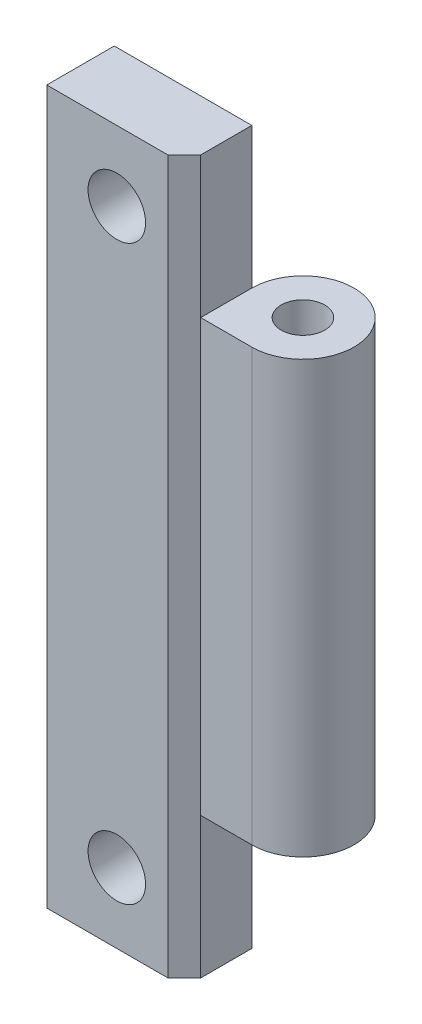
ISO-10303-21;
HEADER;
FILE_DESCRIPTION(('STEP AP214'),'2;1');
FILE_NAME('part.step','',(''),(''),'','','');
FILE_SCHEMA(('AUTOMOTIVE_DESIGN { 1 0 10303 214 1 1 1 1 }'));
ENDSEC;
DATA;
#1=APPLICATION_CONTEXT('core data for automotive mechanical design processes');
#2=APPLICATION_PROTOCOL_DEFINITION('international standard','automotive_design',2000,#1);
#3=PRODUCT_CONTEXT('',#1,'mechanical');
#4=PRODUCT('Part','Part','',(#3));
#5=PRODUCT_RELATED_PRODUCT_CATEGORY('part','',(#4));
#6=PRODUCT_DEFINITION_FORMATION('','',#4);
#7=PRODUCT_DEFINITION_CONTEXT('part definition',#1,'design');
#8=PRODUCT_DEFINITION('design','',#6,#7);
#9=PRODUCT_DEFINITION_SHAPE('','',#8);
#10=(LENGTH_UNIT() NAMED_UNIT(*) SI_UNIT(.MILLI.,.METRE.));
#11=(NAMED_UNIT(*) PLANE_ANGLE_UNIT() SI_UNIT($,.RADIAN.));
#12=(NAMED_UNIT(*) SI_UNIT($,.STERADIAN.) SOLID_ANGLE_UNIT());
#13=UNCERTAINTY_MEASURE_WITH_UNIT(LENGTH_MEASURE(1.E-05),#10,'distance_accuracy_value','');
#14=(GEOMETRIC_REPRESENTATION_CONTEXT(3) GLOBAL_UNCERTAINTY_ASSIGNED_CONTEXT((#13)) GLOBAL_UNIT_ASSIGNED_CONTEXT((#10,
#11,#12)) REPRESENTATION_CONTEXT('',''));
#15=CARTESIAN_POINT('',(0.,0.,0.));
#16=DIRECTION('',(0.,0.,1.));
#17=DIRECTION('',(1.,0.,0.));
#18=AXIS2_PLACEMENT_3D('',#15,#16,#17);
#19=CARTESIAN_POINT('',(0.,33.528,0.));
#20=DIRECTION('',(0.,-1.,0.));
#21=DIRECTION('',(0.,0.,-1.));
#22=AXIS2_PLACEMENT_3D('',#19,#20,#21);
#23=CYLINDRICAL_SURFACE('',#22,1.0254);
#24=CARTESIAN_POINT('',(0.,26.902666159,0.));
#25=DIRECTION('',(0.,-1.,0.));
#26=DIRECTION('',(0.,0.,-1.));
#27=AXIS2_PLACEMENT_3D('',#24,#25,#26);
#28=CIRCLE('',#27,1.0254);
#29=CARTESIAN_POINT('',(0.,26.902666159,-1.0254));
#30=VERTEX_POINT('',#29);
#31=EDGE_CURVE('E103',#30,#30,#28,.F.);
#32=ORIENTED_EDGE('',*,*,#31,.T.);
#33=EDGE_LOOP('',(#32));
#34=FACE_BOUND('',#33,.T.);
#35=CARTESIAN_POINT('',(0.,6.625333841,0.));
#36=DIRECTION('',(0.,-1.,0.));
#37=DIRECTION('',(0.,0.,-1.));
#38=AXIS2_PLACEMENT_3D('',#35,#36,#37);
#39=CIRCLE('',#38,1.0254);
#40=CARTESIAN_POINT('',(0.,6.625333841,-1.0254));
#41=VERTEX_POINT('',#40);
#42=EDGE_CURVE('E19',#41,#41,#39,.T.);
#43=ORIENTED_EDGE('',*,*,#42,.T.);
#44=EDGE_LOOP('',(#43));
#45=FACE_BOUND('',#44,.T.);
#46=ADVANCED_FACE('F16',(#34,#45),#23,.F.);
#47=CARTESIAN_POINT('',(0.,0.,2.404615714));
#48=DIRECTION('',(0.,0.,-1.));
#49=DIRECTION('',(-1.,0.,0.));
#50=AXIS2_PLACEMENT_3D('',#47,#48,#49);
#51=PLANE('',#50);
#52=DIRECTION('',(1.,0.,0.));
#53=VECTOR('',#52,1.);
#54=CARTESIAN_POINT('',(2.404615714,6.625333841,2.404615714));
#55=LINE('',#54,#53);
#56=CARTESIAN_POINT('',(-2.4046157138453,6.625333841,2.404615714));
#57=VERTEX_POINT('',#56);
#58=CARTESIAN_POINT('',(0.,6.625333841,2.404615714));
#59=VERTEX_POINT('',#58);
#60=EDGE_CURVE('E88',#57,#59,#55,.T.);
#61=ORIENTED_EDGE('',*,*,#60,.T.);
#62=DIRECTION('',(0.,-1.,0.));
#63=VECTOR('',#62,1.);
#64=CARTESIAN_POINT('',(0.,33.528,2.404615714));
#65=LINE('',#64,#63);
#66=CARTESIAN_POINT('',(0.,26.902666159,2.404615714));
#67=VERTEX_POINT('',#66);
#68=EDGE_CURVE('E95',#67,#59,#65,.T.);
#69=ORIENTED_EDGE('',*,*,#68,.F.);
#70=DIRECTION('',(1.,0.,0.));
#71=VECTOR('',#70,1.);
#72=CARTESIAN_POINT('',(2.404615714,26.902666159,2.404615714));
#73=LINE('',#72,#71);
#74=CARTESIAN_POINT('',(-2.40461571389686,26.902666159,2.404615714));
#75=VERTEX_POINT('',#74);
#76=EDGE_CURVE('E106',#67,#75,#73,.F.);
#77=ORIENTED_EDGE('',*,*,#76,.T.);
#78=DIRECTION('',(0.,1.,0.));
#79=VECTOR('',#78,1.);
#80=CARTESIAN_POINT('',(-2.404615714,0.,2.404615714));
#81=LINE('',#80,#79);
#82=EDGE_CURVE('E102',#75,#57,#81,.F.);
#83=ORIENTED_EDGE('',*,*,#82,.T.);
#84=EDGE_LOOP('',(#61,#69,#77,#83));
#85=FACE_BOUND('',#84,.T.);
#86=ADVANCED_FACE('F101',(#85),#51,.F.);
#87=CARTESIAN_POINT('',(2.404615714,6.625333841,-2.404615714));
#88=DIRECTION('',(0.,1.,0.));
#89=DIRECTION('',(0.,0.,1.));
#90=AXIS2_PLACEMENT_3D('',#87,#88,#89);
#91=PLANE('',#90);
#92=ORIENTED_EDGE('',*,*,#60,.F.);
#93=DIRECTION('',(0.,0.,1.));
#94=VECTOR('',#93,1.);
#95=CARTESIAN_POINT('',(-2.40461571379373,6.625333841,-2.404615714));
#96=LINE('',#95,#94);
#97=CARTESIAN_POINT('',(-2.40461571379373,6.625333841,-3.14959999990483E-05));
#98=VERTEX_POINT('',#97);
#99=EDGE_CURVE('E91',#57,#98,#96,.F.);
#100=ORIENTED_EDGE('',*,*,#99,.T.);
#101=CARTESIAN_POINT('',(0.,6.625333841,0.));
#102=DIRECTION('',(0.,-1.,0.));
#103=DIRECTION('',(0.,0.,-1.));
#104=AXIS2_PLACEMENT_3D('',#101,#102,#103);
#105=CIRCLE('',#104,2.404615714);
#106=EDGE_CURVE('E84',#59,#98,#105,.F.);
#107=ORIENTED_EDGE('',*,*,#106,.F.);
#108=EDGE_LOOP('',(#92,#100,#107));
#109=FACE_BOUND('',#108,.T.);
#110=ORIENTED_EDGE('',*,*,#42,.F.);
#111=EDGE_LOOP('',(#110));
#112=FACE_BOUND('',#111,.T.);
#113=ADVANCED_FACE('F85',(#109,#112),#91,.F.);
#114=CARTESIAN_POINT('',(2.404615714,26.902666159,-2.404615714));
#115=DIRECTION('',(0.,-1.,0.));
#116=DIRECTION('',(0.,0.,-1.));
#117=AXIS2_PLACEMENT_3D('',#114,#115,#116);
#118=PLANE('',#117);
#119=ORIENTED_EDGE('',*,*,#76,.F.);
#120=CARTESIAN_POINT('',(0.,26.902666159,0.));
#121=DIRECTION('',(0.,-1.,0.));
#122=DIRECTION('',(0.,0.,-1.));
#123=AXIS2_PLACEMENT_3D('',#120,#121,#122);
#124=CIRCLE('',#123,2.404615714);
#125=CARTESIAN_POINT('',(-2.40461571379373,26.902666159,-3.14959999990483E-05));
#126=VERTEX_POINT('',#125);
#127=EDGE_CURVE('E79',#126,#67,#124,.T.);
#128=ORIENTED_EDGE('',*,*,#127,.F.);
#129=DIRECTION('',(0.,0.,1.));
#130=VECTOR('',#129,1.);
#131=CARTESIAN_POINT('',(-2.40461571379373,26.902666159,-2.404615714));
#132=LINE('',#131,#130);
#133=EDGE_CURVE('E93',#126,#75,#132,.T.);
#134=ORIENTED_EDGE('',*,*,#133,.T.);
#135=EDGE_LOOP('',(#119,#128,#134));
#136=FACE_BOUND('',#135,.T.);
#137=ORIENTED_EDGE('',*,*,#31,.F.);
#138=EDGE_LOOP('',(#137));
#139=FACE_BOUND('',#138,.T.);
#140=ADVANCED_FACE('F209',(#136,#139),#118,.F.);
#141=CARTESIAN_POINT('',(-2.404615714,0.,2.404615714));
#142=DIRECTION('',(-0.707106781186544,0.,-0.707106781186551));
#143=DIRECTION('',(-0.707106781186551,0.,0.707106781186544));
#144=AXIS2_PLACEMENT_3D('',#141,#142,#143);
#145=PLANE('',#144);
#146=DIRECTION('',(0.,1.,0.));
#147=VECTOR('',#146,1.);
#148=CARTESIAN_POINT('',(-3.17496596400001,33.528,3.174965964));
#149=LINE('',#148,#147);
#150=CARTESIAN_POINT('',(-3.17496596400001,33.528,3.174965964));
#151=VERTEX_POINT('',#150);
#152=CARTESIAN_POINT('',(-3.17496596400001,0.,3.174965964));
#153=VERTEX_POINT('',#152);
#154=EDGE_CURVE('E140',#151,#153,#149,.F.);
#155=ORIENTED_EDGE('',*,*,#154,.T.);
#156=DIRECTION('',(-0.707106781186551,0.,0.707106781186544));
#157=VECTOR('',#156,1.);
#158=CARTESIAN_POINT('',(-2.404615714,0.,2.404615714));
#159=LINE('',#158,#157);
#160=CARTESIAN_POINT('',(-2.40461571389687,0.,2.40461571396562));
#161=VERTEX_POINT('',#160);
#162=EDGE_CURVE('E128',#161,#153,#159,.T.);
#163=ORIENTED_EDGE('',*,*,#162,.F.);
#164=DIRECTION('',(0.,1.,0.));
#165=VECTOR('',#164,1.);
#166=CARTESIAN_POINT('',(-2.40461571379373,33.528,2.404615714));
#167=LINE('',#166,#165);
#168=EDGE_CURVE('E115',#161,#57,#167,.T.);
#169=ORIENTED_EDGE('',*,*,#168,.T.);
#170=ORIENTED_EDGE('',*,*,#82,.F.);
#171=DIRECTION('',(0.,1.,0.));
#172=VECTOR('',#171,1.);
#173=CARTESIAN_POINT('',(-2.40461571379373,33.528,2.404615714));
#174=LINE('',#173,#172);
#175=CARTESIAN_POINT('',(-2.40461571394843,33.528,2.404615714));
#176=VERTEX_POINT('',#175);
#177=EDGE_CURVE('E331',#75,#176,#174,.T.);
#178=ORIENTED_EDGE('',*,*,#177,.T.);
#179=DIRECTION('',(-0.707106781186551,0.,0.707106781186544));
#180=VECTOR('',#179,1.);
#181=CARTESIAN_POINT('',(-2.404615714,33.528,2.404615714));
#182=LINE('',#181,#180);
#183=EDGE_CURVE('E130',#151,#176,#182,.F.);
#184=ORIENTED_EDGE('',*,*,#183,.F.);
#185=EDGE_LOOP('',(#155,#163,#169,#170,#178,#184));
#186=FACE_BOUND('',#185,.T.);
#187=ADVANCED_FACE('F205',(#186),#145,.F.);
#188=CARTESIAN_POINT('',(0.,33.528,3.174965964));
#189=DIRECTION('',(0.,0.,-1.));
#190=DIRECTION('',(-1.,0.,0.));
#191=AXIS2_PLACEMENT_3D('',#188,#189,#190);
#192=PLANE('',#191);
#193=ORIENTED_EDGE('',*,*,#154,.F.);
#194=DIRECTION('',(1.,0.,0.));
#195=VECTOR('',#194,1.);
#196=CARTESIAN_POINT('',(0.,33.528,3.174965964));
#197=LINE('',#196,#195);
#198=CARTESIAN_POINT('',(-8.873233714,33.528,3.174965964));
#199=VERTEX_POINT('',#198);
#200=EDGE_CURVE('E340',#199,#151,#197,.T.);
#201=ORIENTED_EDGE('',*,*,#200,.F.);
#202=DIRECTION('',(0.,1.,0.));
#203=VECTOR('',#202,1.);
#204=CARTESIAN_POINT('',(-8.873233714,33.528,3.174965964));
#205=LINE('',#204,#203);
#206=CARTESIAN_POINT('',(-8.873233714,0.,3.174965964));
#207=VERTEX_POINT('',#206);
#208=EDGE_CURVE('E349',#199,#207,#205,.F.);
#209=ORIENTED_EDGE('',*,*,#208,.T.);
#210=DIRECTION('',(1.,0.,0.));
#211=VECTOR('',#210,1.);
#212=CARTESIAN_POINT('',(0.,0.,3.174965964));
#213=LINE('',#212,#211);
#214=EDGE_CURVE('E137',#207,#153,#213,.T.);
#215=ORIENTED_EDGE('',*,*,#214,.T.);
#216=EDGE_LOOP('',(#193,#201,#209,#215));
#217=FACE_BOUND('',#216,.T.);
#218=CARTESIAN_POINT('',(-5.578853714,3.29361581839627,3.174965964));
#219=DIRECTION('',(0.,0.,-1.));
#220=DIRECTION('',(-1.,0.,0.));
#221=AXIS2_PLACEMENT_3D('',#218,#219,#220);
#222=CIRCLE('',#221,1.35254999999999);
#223=CARTESIAN_POINT('',(-6.93140371399999,3.29361581839627,3.174965964));
#224=VERTEX_POINT('',#223);
#225=EDGE_CURVE('E125',#224,#224,#222,.T.);
#226=ORIENTED_EDGE('',*,*,#225,.T.);
#227=EDGE_LOOP('',(#226));
#228=FACE_BOUND('',#227,.T.);
#229=CARTESIAN_POINT('',(-5.578853714,30.2343841816037,3.174965964));
#230=DIRECTION('',(0.,0.,-1.));
#231=DIRECTION('',(-1.,0.,0.));
#232=AXIS2_PLACEMENT_3D('',#229,#230,#231);
#233=CIRCLE('',#232,1.35254999999999);
#234=CARTESIAN_POINT('',(-6.93140371399999,30.2343841816037,3.174965964));
#235=VERTEX_POINT('',#234);
#236=EDGE_CURVE('E143',#235,#235,#233,.T.);
#237=ORIENTED_EDGE('',*,*,#236,.T.);
#238=EDGE_LOOP('',(#237));
#239=FACE_BOUND('',#238,.T.);
#240=ADVANCED_FACE('F160',(#217,#228,#239),#192,.F.);
#241=CARTESIAN_POINT('',(-5.578853714,30.2343841816037,-3.14959999990483E-05));
#242=DIRECTION('',(0.,0.,-1.));
#243=DIRECTION('',(-1.,0.,0.));
#244=AXIS2_PLACEMENT_3D('',#241,#242,#243);
#245=CYLINDRICAL_SURFACE('',#244,1.35254999999999);
#246=ORIENTED_EDGE('',*,*,#236,.F.);
#247=EDGE_LOOP('',(#246));
#248=FACE_BOUND('',#247,.T.);
#249=CARTESIAN_POINT('',(-5.578853714,30.2343841816037,-3.14960000004379E-05));
#250=DIRECTION('',(0.,0.,-1.));
#251=DIRECTION('',(-1.,0.,0.));
#252=AXIS2_PLACEMENT_3D('',#249,#250,#251);
#253=CIRCLE('',#252,1.35254999999999);
#254=CARTESIAN_POINT('',(-6.93140371399999,30.2343841816037,-3.14960000004379E-05));
#255=VERTEX_POINT('',#254);
#256=EDGE_CURVE('E136',#255,#255,#253,.T.);
#257=ORIENTED_EDGE('',*,*,#256,.T.);
#258=EDGE_LOOP('',(#257));
#259=FACE_BOUND('',#258,.T.);
#260=ADVANCED_FACE('F162',(#248,#259),#245,.F.);
#261=CARTESIAN_POINT('',(-5.578853714,3.29361581839627,-3.14959999990483E-05));
#262=DIRECTION('',(0.,0.,-1.));
#263=DIRECTION('',(-1.,0.,0.));
#264=AXIS2_PLACEMENT_3D('',#261,#262,#263);
#265=CYLINDRICAL_SURFACE('',#264,1.35254999999999);
#266=ORIENTED_EDGE('',*,*,#225,.F.);
#267=EDGE_LOOP('',(#266));
#268=FACE_BOUND('',#267,.T.);
#269=CARTESIAN_POINT('',(-5.578853714,3.29361581839627,-3.14960000004379E-05));
#270=DIRECTION('',(0.,0.,-1.));
#271=DIRECTION('',(-1.,0.,0.));
#272=AXIS2_PLACEMENT_3D('',#269,#270,#271);
#273=CIRCLE('',#272,1.35254999999999);
#274=CARTESIAN_POINT('',(-6.93140371399999,3.29361581839627,-3.14960000004379E-05));
#275=VERTEX_POINT('',#274);
#276=EDGE_CURVE('E122',#275,#275,#273,.T.);
#277=ORIENTED_EDGE('',*,*,#276,.T.);
#278=EDGE_LOOP('',(#277));
#279=FACE_BOUND('',#278,.T.);
#280=ADVANCED_FACE('F165',(#268,#279),#265,.F.);
#281=CARTESIAN_POINT('',(-2.40461571379373,33.528,-2.404615714));
#282=DIRECTION('',(-1.,0.,0.));
#283=DIRECTION('',(0.,0.,1.));
#284=AXIS2_PLACEMENT_3D('',#281,#282,#283);
#285=PLANE('',#284);
#286=ORIENTED_EDGE('',*,*,#168,.F.);
#287=DIRECTION('',(0.,0.,1.));
#288=VECTOR('',#287,1.);
#289=CARTESIAN_POINT('',(-2.404615714,0.,0.));
#290=LINE('',#289,#288);
#291=CARTESIAN_POINT('',(-2.4046157138453,0.,-3.14959999990483E-05));
#292=VERTEX_POINT('',#291);
#293=EDGE_CURVE('E133',#161,#292,#290,.F.);
#294=ORIENTED_EDGE('',*,*,#293,.T.);
#295=DIRECTION('',(0.,1.,0.));
#296=VECTOR('',#295,1.);
#297=CARTESIAN_POINT('',(-2.40461571379373,33.528,-3.14959999990483E-05));
#298=LINE('',#297,#296);
#299=EDGE_CURVE('E118',#292,#98,#298,.T.);
#300=ORIENTED_EDGE('',*,*,#299,.T.);
#301=ORIENTED_EDGE('',*,*,#99,.F.);
#302=EDGE_LOOP('',(#286,#294,#300,#301));
#303=FACE_BOUND('',#302,.T.);
#304=ADVANCED_FACE('F196',(#303),#285,.F.);
#305=CARTESIAN_POINT('',(0.,33.528,0.));
#306=DIRECTION('',(0.,-1.,0.));
#307=DIRECTION('',(0.,0.,-1.));
#308=AXIS2_PLACEMENT_3D('',#305,#306,#307);
#309=CYLINDRICAL_SURFACE('',#308,2.404615714);
#310=ORIENTED_EDGE('',*,*,#106,.T.);
#311=DIRECTION('',(0.,1.,0.));
#312=VECTOR('',#311,1.);
#313=CARTESIAN_POINT('',(-2.40461571379373,33.528,-3.14959999990483E-05));
#314=LINE('',#313,#312);
#315=EDGE_CURVE('E121',#98,#126,#314,.T.);
#316=ORIENTED_EDGE('',*,*,#315,.T.);
#317=ORIENTED_EDGE('',*,*,#127,.T.);
#318=ORIENTED_EDGE('',*,*,#68,.T.);
#319=EDGE_LOOP('',(#310,#316,#317,#318));
#320=FACE_BOUND('',#319,.T.);
#321=ADVANCED_FACE('F96',(#320),#309,.T.);
#322=CARTESIAN_POINT('',(-2.40461571379373,33.528,-2.404615714));
#323=DIRECTION('',(-1.,0.,0.));
#324=DIRECTION('',(0.,0.,1.));
#325=AXIS2_PLACEMENT_3D('',#322,#323,#324);
#326=PLANE('',#325);
#327=ORIENTED_EDGE('',*,*,#177,.F.);
#328=ORIENTED_EDGE('',*,*,#133,.F.);
#329=DIRECTION('',(0.,1.,0.));
#330=VECTOR('',#329,1.);
#331=CARTESIAN_POINT('',(-2.40461571379373,33.528,-3.14959999990483E-05));
#332=LINE('',#331,#330);
#333=CARTESIAN_POINT('',(-2.4046157138453,33.528,-3.14959999990483E-05));
#334=VERTEX_POINT('',#333);
#335=EDGE_CURVE('E326',#126,#334,#332,.T.);
#336=ORIENTED_EDGE('',*,*,#335,.T.);
#337=DIRECTION('',(0.,0.,1.));
#338=VECTOR('',#337,1.);
#339=CARTESIAN_POINT('',(-2.404615714,33.528,0.));
#340=LINE('',#339,#338);
#341=EDGE_CURVE('E337',#176,#334,#340,.F.);
#342=ORIENTED_EDGE('',*,*,#341,.F.);
#343=EDGE_LOOP('',(#327,#328,#336,#342));
#344=FACE_BOUND('',#343,.T.);
#345=ADVANCED_FACE('F189',(#344),#326,.F.);
#346=CARTESIAN_POINT('',(0.,33.528,0.));
#347=DIRECTION('',(0.,1.,0.));
#348=DIRECTION('',(0.,0.,1.));
#349=AXIS2_PLACEMENT_3D('',#346,#347,#348);
#350=PLANE('',#349);
#351=DIRECTION('',(0.,0.,-1.));
#352=VECTOR('',#351,1.);
#353=CARTESIAN_POINT('',(-8.873233714,33.528,3.174965964));
#354=LINE('',#353,#352);
#355=CARTESIAN_POINT('',(-8.873233714,33.528,-3.14959999990483E-05));
#356=VERTEX_POINT('',#355);
#357=EDGE_CURVE('E344',#356,#199,#354,.F.);
#358=ORIENTED_EDGE('',*,*,#357,.T.);
#359=ORIENTED_EDGE('',*,*,#200,.T.);
#360=ORIENTED_EDGE('',*,*,#183,.T.);
#361=ORIENTED_EDGE('',*,*,#341,.T.);
#362=DIRECTION('',(1.,0.,0.));
#363=VECTOR('',#362,1.);
#364=CARTESIAN_POINT('',(-8.873233714,33.528,-3.14959999990483E-05));
#365=LINE('',#364,#363);
#366=EDGE_CURVE('E329',#334,#356,#365,.F.);
#367=ORIENTED_EDGE('',*,*,#366,.T.);
#368=EDGE_LOOP('',(#358,#359,#360,#361,#367));
#369=FACE_BOUND('',#368,.T.);
#370=ADVANCED_FACE('F185',(#369),#350,.T.);
#371=CARTESIAN_POINT('',(-8.873233714,33.528,3.174965964));
#372=DIRECTION('',(1.,0.,0.));
#373=DIRECTION('',(0.,0.,-1.));
#374=AXIS2_PLACEMENT_3D('',#371,#372,#373);
#375=PLANE('',#374);
#376=ORIENTED_EDGE('',*,*,#208,.F.);
#377=ORIENTED_EDGE('',*,*,#357,.F.);
#378=DIRECTION('',(0.,1.,0.));
#379=VECTOR('',#378,1.);
#380=CARTESIAN_POINT('',(-8.873233714,33.528,-3.14959999990483E-05));
#381=LINE('',#380,#379);
#382=CARTESIAN_POINT('',(-8.873233714,0.,-3.14959999990483E-05));
#383=VERTEX_POINT('',#382);
#384=EDGE_CURVE('E25',#356,#383,#381,.F.);
#385=ORIENTED_EDGE('',*,*,#384,.T.);
#386=DIRECTION('',(0.,0.,1.));
#387=VECTOR('',#386,1.);
#388=CARTESIAN_POINT('',(-8.873233714,0.,0.));
#389=LINE('',#388,#387);
#390=EDGE_CURVE('E33',#383,#207,#389,.T.);
#391=ORIENTED_EDGE('',*,*,#390,.T.);
#392=EDGE_LOOP('',(#376,#377,#385,#391));
#393=FACE_BOUND('',#392,.T.);
#394=ADVANCED_FACE('F178',(#393),#375,.F.);
#395=CARTESIAN_POINT('',(0.,0.,0.));
#396=DIRECTION('',(0.,1.,0.));
#397=DIRECTION('',(0.,0.,1.));
#398=AXIS2_PLACEMENT_3D('',#395,#396,#397);
#399=PLANE('',#398);
#400=ORIENTED_EDGE('',*,*,#162,.T.);
#401=ORIENTED_EDGE('',*,*,#214,.F.);
#402=ORIENTED_EDGE('',*,*,#390,.F.);
#403=DIRECTION('',(1.,0.,0.));
#404=VECTOR('',#403,1.);
#405=CARTESIAN_POINT('',(-8.873233714,0.,-3.14959999990483E-05));
#406=LINE('',#405,#404);
#407=EDGE_CURVE('E10',#383,#292,#406,.T.);
#408=ORIENTED_EDGE('',*,*,#407,.T.);
#409=ORIENTED_EDGE('',*,*,#293,.F.);
#410=EDGE_LOOP('',(#400,#401,#402,#408,#409));
#411=FACE_BOUND('',#410,.T.);
#412=ADVANCED_FACE('F171',(#411),#399,.F.);
#413=CARTESIAN_POINT('',(-8.873233714,33.528,-3.14959999990483E-05));
#414=DIRECTION('',(0.,0.,1.));
#415=DIRECTION('',(1.,0.,0.));
#416=AXIS2_PLACEMENT_3D('',#413,#414,#415);
#417=PLANE('',#416);
#418=ORIENTED_EDGE('',*,*,#384,.F.);
#419=ORIENTED_EDGE('',*,*,#366,.F.);
#420=ORIENTED_EDGE('',*,*,#335,.F.);
#421=ORIENTED_EDGE('',*,*,#315,.F.);
#422=ORIENTED_EDGE('',*,*,#299,.F.);
#423=ORIENTED_EDGE('',*,*,#407,.F.);
#424=EDGE_LOOP('',(#418,#419,#420,#421,#422,#423));
#425=FACE_BOUND('',#424,.T.);
#426=ORIENTED_EDGE('',*,*,#276,.F.);
#427=EDGE_LOOP('',(#426));
#428=FACE_BOUND('',#427,.T.);
#429=ORIENTED_EDGE('',*,*,#256,.F.);
#430=EDGE_LOOP('',(#429));
#431=FACE_BOUND('',#430,.T.);
#432=ADVANCED_FACE('F169',(#425,#428,#431),#417,.F.);
#433=CLOSED_SHELL('',(#46,#86,#113,#140,#187,#240,#260,#280,#304,#321,#345,#370,#394,#412,#432));
#434=MANIFOLD_SOLID_BREP('B1',#433);
#435=ADVANCED_BREP_SHAPE_REPRESENTATION('',(#18,#434),#14);
#436=SHAPE_DEFINITION_REPRESENTATION(#9,#435);
ENDSEC;
END-ISO-10303-21;
